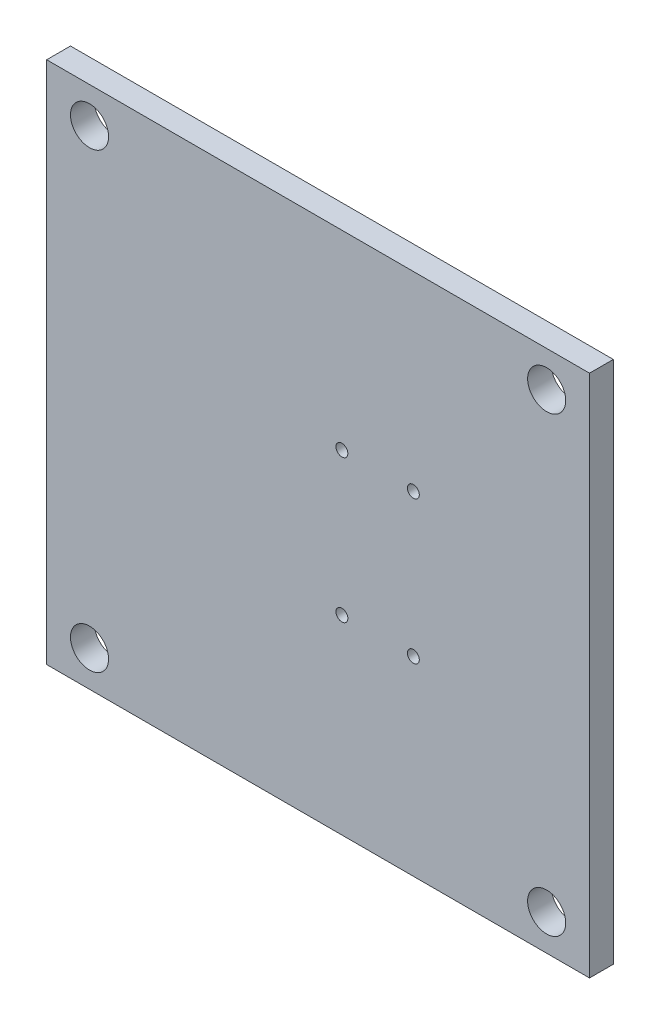
ISO-10303-21;
HEADER;
FILE_DESCRIPTION(('STEP AP214'),'2;1');
FILE_NAME('part.step','',(''),(''),'','','');
FILE_SCHEMA(('AUTOMOTIVE_DESIGN { 1 0 10303 214 1 1 1 1 }'));
ENDSEC;
DATA;
#1=APPLICATION_CONTEXT('core data for automotive mechanical design processes');
#2=APPLICATION_PROTOCOL_DEFINITION('international standard','automotive_design',2000,#1);
#3=PRODUCT_CONTEXT('',#1,'mechanical');
#4=PRODUCT('Part','Part','',(#3));
#5=PRODUCT_RELATED_PRODUCT_CATEGORY('part','',(#4));
#6=PRODUCT_DEFINITION_FORMATION('','',#4);
#7=PRODUCT_DEFINITION_CONTEXT('part definition',#1,'design');
#8=PRODUCT_DEFINITION('design','',#6,#7);
#9=PRODUCT_DEFINITION_SHAPE('','',#8);
#10=(LENGTH_UNIT() NAMED_UNIT(*) SI_UNIT(.MILLI.,.METRE.));
#11=(NAMED_UNIT(*) PLANE_ANGLE_UNIT() SI_UNIT($,.RADIAN.));
#12=(NAMED_UNIT(*) SI_UNIT($,.STERADIAN.) SOLID_ANGLE_UNIT());
#13=UNCERTAINTY_MEASURE_WITH_UNIT(LENGTH_MEASURE(1.E-05),#10,'distance_accuracy_value','');
#14=(GEOMETRIC_REPRESENTATION_CONTEXT(3) GLOBAL_UNCERTAINTY_ASSIGNED_CONTEXT((#13)) GLOBAL_UNIT_ASSIGNED_CONTEXT((#10,
#11,#12)) REPRESENTATION_CONTEXT('',''));
#15=CARTESIAN_POINT('',(0.,0.,0.));
#16=DIRECTION('',(0.,0.,1.));
#17=DIRECTION('',(1.,0.,0.));
#18=AXIS2_PLACEMENT_3D('',#15,#16,#17);
#19=CARTESIAN_POINT('',(0.,0.,2.5));
#20=DIRECTION('',(0.,0.,1.));
#21=DIRECTION('',(1.,0.,0.));
#22=AXIS2_PLACEMENT_3D('',#19,#20,#21);
#23=PLANE('',#22);
#24=CARTESIAN_POINT('',(5.00000000000012,-15.,2.5));
#25=DIRECTION('',(0.,0.,1.));
#26=DIRECTION('',(1.,0.,0.));
#27=AXIS2_PLACEMENT_3D('',#24,#25,#26);
#28=CIRCLE('',#27,1.25);
#29=CARTESIAN_POINT('',(6.25000000000011,-15.,2.5));
#30=VERTEX_POINT('',#29);
#31=EDGE_CURVE('E158',#30,#30,#28,.T.);
#32=ORIENTED_EDGE('',*,*,#31,.F.);
#33=EDGE_LOOP('',(#32));
#34=FACE_BOUND('',#33,.T.);
#35=CARTESIAN_POINT('',(20.0000000000001,-15.,2.5));
#36=DIRECTION('',(0.,0.,1.));
#37=DIRECTION('',(1.,0.,0.));
#38=AXIS2_PLACEMENT_3D('',#35,#36,#37);
#39=CIRCLE('',#38,1.25);
#40=CARTESIAN_POINT('',(21.2500000000001,-15.,2.5));
#41=VERTEX_POINT('',#40);
#42=EDGE_CURVE('E152',#41,#41,#39,.T.);
#43=ORIENTED_EDGE('',*,*,#42,.F.);
#44=EDGE_LOOP('',(#43));
#45=FACE_BOUND('',#44,.T.);
#46=CARTESIAN_POINT('',(5.00000000000012,15.,2.5));
#47=DIRECTION('',(0.,0.,1.));
#48=DIRECTION('',(1.,0.,0.));
#49=AXIS2_PLACEMENT_3D('',#46,#47,#48);
#50=CIRCLE('',#49,1.25);
#51=CARTESIAN_POINT('',(6.25000000000011,15.,2.5));
#52=VERTEX_POINT('',#51);
#53=EDGE_CURVE('E146',#52,#52,#50,.T.);
#54=ORIENTED_EDGE('',*,*,#53,.F.);
#55=EDGE_LOOP('',(#54));
#56=FACE_BOUND('',#55,.T.);
#57=CARTESIAN_POINT('',(20.0000000000001,15.,2.5));
#58=DIRECTION('',(0.,0.,1.));
#59=DIRECTION('',(1.,0.,0.));
#60=AXIS2_PLACEMENT_3D('',#57,#58,#59);
#61=CIRCLE('',#60,1.25);
#62=CARTESIAN_POINT('',(21.2500000000001,15.,2.5));
#63=VERTEX_POINT('',#62);
#64=EDGE_CURVE('E140',#63,#63,#61,.T.);
#65=ORIENTED_EDGE('',*,*,#64,.F.);
#66=EDGE_LOOP('',(#65));
#67=FACE_BOUND('',#66,.T.);
#68=CARTESIAN_POINT('',(-48.,-47.5,2.5));
#69=DIRECTION('',(0.,0.,-1.));
#70=DIRECTION('',(1.,0.,0.));
#71=AXIS2_PLACEMENT_3D('',#68,#69,#70);
#72=CIRCLE('',#71,4.);
#73=CARTESIAN_POINT('',(-44.,-47.5,2.5));
#74=VERTEX_POINT('',#73);
#75=EDGE_CURVE('E120',#74,#74,#72,.T.);
#76=ORIENTED_EDGE('',*,*,#75,.T.);
#77=EDGE_LOOP('',(#76));
#78=FACE_BOUND('',#77,.T.);
#79=CARTESIAN_POINT('',(-48.,47.5,2.5));
#80=DIRECTION('',(0.,0.,1.));
#81=DIRECTION('',(1.,0.,0.));
#82=AXIS2_PLACEMENT_3D('',#79,#80,#81);
#83=CIRCLE('',#82,4.);
#84=CARTESIAN_POINT('',(-44.,47.5,2.5));
#85=VERTEX_POINT('',#84);
#86=EDGE_CURVE('E114',#85,#85,#83,.T.);
#87=ORIENTED_EDGE('',*,*,#86,.F.);
#88=EDGE_LOOP('',(#87));
#89=FACE_BOUND('',#88,.T.);
#90=DIRECTION('',(0.,1.,0.));
#91=VECTOR('',#90,1.);
#92=CARTESIAN_POINT('',(57.,55.,2.5));
#93=LINE('',#92,#91);
#94=CARTESIAN_POINT('',(57.,-55.,2.5));
#95=VERTEX_POINT('',#94);
#96=CARTESIAN_POINT('',(57.,55.,2.5));
#97=VERTEX_POINT('',#96);
#98=EDGE_CURVE('E87',#95,#97,#93,.T.);
#99=ORIENTED_EDGE('',*,*,#98,.T.);
#100=DIRECTION('',(-1.,0.,0.));
#101=VECTOR('',#100,1.);
#102=CARTESIAN_POINT('',(-57.,55.,2.5));
#103=LINE('',#102,#101);
#104=CARTESIAN_POINT('',(-57.,55.,2.5));
#105=VERTEX_POINT('',#104);
#106=EDGE_CURVE('E82',#97,#105,#103,.T.);
#107=ORIENTED_EDGE('',*,*,#106,.T.);
#108=DIRECTION('',(0.,-1.,0.));
#109=VECTOR('',#108,1.);
#110=CARTESIAN_POINT('',(-57.,55.,2.5));
#111=LINE('',#110,#109);
#112=CARTESIAN_POINT('',(-57.,-55.,2.5));
#113=VERTEX_POINT('',#112);
#114=EDGE_CURVE('E85',#105,#113,#111,.T.);
#115=ORIENTED_EDGE('',*,*,#114,.T.);
#116=DIRECTION('',(1.,0.,0.));
#117=VECTOR('',#116,1.);
#118=CARTESIAN_POINT('',(-57.,-55.,2.5));
#119=LINE('',#118,#117);
#120=EDGE_CURVE('E52',#113,#95,#119,.T.);
#121=ORIENTED_EDGE('',*,*,#120,.T.);
#122=EDGE_LOOP('',(#99,#107,#115,#121));
#123=FACE_BOUND('',#122,.T.);
#124=CARTESIAN_POINT('',(48.,-47.5,2.5));
#125=DIRECTION('',(0.,0.,1.));
#126=DIRECTION('',(-1.,0.,0.));
#127=AXIS2_PLACEMENT_3D('',#124,#125,#126);
#128=CIRCLE('',#127,4.);
#129=CARTESIAN_POINT('',(44.,-47.5,2.5));
#130=VERTEX_POINT('',#129);
#131=EDGE_CURVE('E126',#130,#130,#128,.T.);
#132=ORIENTED_EDGE('',*,*,#131,.F.);
#133=EDGE_LOOP('',(#132));
#134=FACE_BOUND('',#133,.T.);
#135=CARTESIAN_POINT('',(48.,47.5,2.5));
#136=DIRECTION('',(0.,0.,-1.));
#137=DIRECTION('',(-1.,0.,0.));
#138=AXIS2_PLACEMENT_3D('',#135,#136,#137);
#139=CIRCLE('',#138,4.);
#140=CARTESIAN_POINT('',(44.,47.5,2.5));
#141=VERTEX_POINT('',#140);
#142=EDGE_CURVE('E132',#141,#141,#139,.T.);
#143=ORIENTED_EDGE('',*,*,#142,.T.);
#144=EDGE_LOOP('',(#143));
#145=FACE_BOUND('',#144,.T.);
#146=ADVANCED_FACE('F35',(#34,#45,#56,#67,#78,#89,#123,#134,#145),#23,.T.);
#147=CARTESIAN_POINT('',(0.,0.,-2.5));
#148=DIRECTION('',(0.,0.,1.));
#149=DIRECTION('',(1.,0.,0.));
#150=AXIS2_PLACEMENT_3D('',#147,#148,#149);
#151=PLANE('',#150);
#152=CARTESIAN_POINT('',(5.00000000000012,-15.,-2.5));
#153=DIRECTION('',(0.,0.,1.));
#154=DIRECTION('',(1.,0.,0.));
#155=AXIS2_PLACEMENT_3D('',#152,#153,#154);
#156=CIRCLE('',#155,1.25);
#157=CARTESIAN_POINT('',(6.25000000000011,-15.,-2.5));
#158=VERTEX_POINT('',#157);
#159=EDGE_CURVE('E155',#158,#158,#156,.T.);
#160=ORIENTED_EDGE('',*,*,#159,.T.);
#161=EDGE_LOOP('',(#160));
#162=FACE_BOUND('',#161,.T.);
#163=CARTESIAN_POINT('',(20.0000000000001,-15.,-2.5));
#164=DIRECTION('',(0.,0.,1.));
#165=DIRECTION('',(1.,0.,0.));
#166=AXIS2_PLACEMENT_3D('',#163,#164,#165);
#167=CIRCLE('',#166,1.25);
#168=CARTESIAN_POINT('',(21.2500000000001,-15.,-2.5));
#169=VERTEX_POINT('',#168);
#170=EDGE_CURVE('E149',#169,#169,#167,.T.);
#171=ORIENTED_EDGE('',*,*,#170,.T.);
#172=EDGE_LOOP('',(#171));
#173=FACE_BOUND('',#172,.T.);
#174=CARTESIAN_POINT('',(5.00000000000012,15.,-2.5));
#175=DIRECTION('',(0.,0.,1.));
#176=DIRECTION('',(1.,0.,0.));
#177=AXIS2_PLACEMENT_3D('',#174,#175,#176);
#178=CIRCLE('',#177,1.25);
#179=CARTESIAN_POINT('',(6.25000000000011,15.,-2.5));
#180=VERTEX_POINT('',#179);
#181=EDGE_CURVE('E143',#180,#180,#178,.T.);
#182=ORIENTED_EDGE('',*,*,#181,.T.);
#183=EDGE_LOOP('',(#182));
#184=FACE_BOUND('',#183,.T.);
#185=CARTESIAN_POINT('',(20.0000000000001,15.,-2.5));
#186=DIRECTION('',(0.,0.,1.));
#187=DIRECTION('',(1.,0.,0.));
#188=AXIS2_PLACEMENT_3D('',#185,#186,#187);
#189=CIRCLE('',#188,1.25);
#190=CARTESIAN_POINT('',(21.2500000000001,15.,-2.5));
#191=VERTEX_POINT('',#190);
#192=EDGE_CURVE('E135',#191,#191,#189,.T.);
#193=ORIENTED_EDGE('',*,*,#192,.T.);
#194=EDGE_LOOP('',(#193));
#195=FACE_BOUND('',#194,.T.);
#196=CARTESIAN_POINT('',(-48.,-47.5,-2.5));
#197=DIRECTION('',(0.,0.,-1.));
#198=DIRECTION('',(1.,0.,0.));
#199=AXIS2_PLACEMENT_3D('',#196,#197,#198);
#200=CIRCLE('',#199,4.);
#201=CARTESIAN_POINT('',(-44.,-47.5,-2.5));
#202=VERTEX_POINT('',#201);
#203=EDGE_CURVE('E117',#202,#202,#200,.T.);
#204=ORIENTED_EDGE('',*,*,#203,.F.);
#205=EDGE_LOOP('',(#204));
#206=FACE_BOUND('',#205,.T.);
#207=CARTESIAN_POINT('',(-48.,47.5,-2.5));
#208=DIRECTION('',(0.,0.,1.));
#209=DIRECTION('',(1.,0.,0.));
#210=AXIS2_PLACEMENT_3D('',#207,#208,#209);
#211=CIRCLE('',#210,4.);
#212=CARTESIAN_POINT('',(-44.,47.5,-2.5));
#213=VERTEX_POINT('',#212);
#214=EDGE_CURVE('E102',#213,#213,#211,.T.);
#215=ORIENTED_EDGE('',*,*,#214,.T.);
#216=EDGE_LOOP('',(#215));
#217=FACE_BOUND('',#216,.T.);
#218=DIRECTION('',(0.,1.,0.));
#219=VECTOR('',#218,1.);
#220=CARTESIAN_POINT('',(57.,55.,-2.5));
#221=LINE('',#220,#219);
#222=CARTESIAN_POINT('',(57.,-55.,-2.5));
#223=VERTEX_POINT('',#222);
#224=CARTESIAN_POINT('',(57.,55.,-2.5));
#225=VERTEX_POINT('',#224);
#226=EDGE_CURVE('E99',#223,#225,#221,.T.);
#227=ORIENTED_EDGE('',*,*,#226,.F.);
#228=DIRECTION('',(1.,0.,0.));
#229=VECTOR('',#228,1.);
#230=CARTESIAN_POINT('',(-57.,-55.,-2.5));
#231=LINE('',#230,#229);
#232=CARTESIAN_POINT('',(-57.,-55.,-2.5));
#233=VERTEX_POINT('',#232);
#234=EDGE_CURVE('E75',#233,#223,#231,.T.);
#235=ORIENTED_EDGE('',*,*,#234,.F.);
#236=DIRECTION('',(0.,-1.,0.));
#237=VECTOR('',#236,1.);
#238=CARTESIAN_POINT('',(-57.,55.,-2.5));
#239=LINE('',#238,#237);
#240=CARTESIAN_POINT('',(-57.,55.,-2.5));
#241=VERTEX_POINT('',#240);
#242=EDGE_CURVE('E69',#241,#233,#239,.T.);
#243=ORIENTED_EDGE('',*,*,#242,.F.);
#244=DIRECTION('',(-1.,0.,0.));
#245=VECTOR('',#244,1.);
#246=CARTESIAN_POINT('',(-57.,55.,-2.5));
#247=LINE('',#246,#245);
#248=EDGE_CURVE('E91',#225,#241,#247,.T.);
#249=ORIENTED_EDGE('',*,*,#248,.F.);
#250=EDGE_LOOP('',(#227,#235,#243,#249));
#251=FACE_BOUND('',#250,.T.);
#252=CARTESIAN_POINT('',(48.,-47.5,-2.5));
#253=DIRECTION('',(0.,0.,1.));
#254=DIRECTION('',(-1.,0.,0.));
#255=AXIS2_PLACEMENT_3D('',#252,#253,#254);
#256=CIRCLE('',#255,4.);
#257=CARTESIAN_POINT('',(44.,-47.5,-2.5));
#258=VERTEX_POINT('',#257);
#259=EDGE_CURVE('E123',#258,#258,#256,.T.);
#260=ORIENTED_EDGE('',*,*,#259,.T.);
#261=EDGE_LOOP('',(#260));
#262=FACE_BOUND('',#261,.T.);
#263=CARTESIAN_POINT('',(48.,47.5,-2.5));
#264=DIRECTION('',(0.,0.,-1.));
#265=DIRECTION('',(-1.,0.,0.));
#266=AXIS2_PLACEMENT_3D('',#263,#264,#265);
#267=CIRCLE('',#266,4.);
#268=CARTESIAN_POINT('',(44.,47.5,-2.5));
#269=VERTEX_POINT('',#268);
#270=EDGE_CURVE('E129',#269,#269,#267,.T.);
#271=ORIENTED_EDGE('',*,*,#270,.F.);
#272=EDGE_LOOP('',(#271));
#273=FACE_BOUND('',#272,.T.);
#274=ADVANCED_FACE('F110',(#162,#173,#184,#195,#206,#217,#251,#262,#273),#151,.F.);
#275=CARTESIAN_POINT('',(57.,55.,2.5));
#276=DIRECTION('',(-1.,0.,0.));
#277=DIRECTION('',(0.,-1.,0.));
#278=AXIS2_PLACEMENT_3D('',#275,#276,#277);
#279=PLANE('',#278);
#280=ORIENTED_EDGE('',*,*,#226,.T.);
#281=DIRECTION('',(0.,0.,-1.));
#282=VECTOR('',#281,1.);
#283=CARTESIAN_POINT('',(57.,55.,2.5));
#284=LINE('',#283,#282);
#285=EDGE_CURVE('E11',#97,#225,#284,.T.);
#286=ORIENTED_EDGE('',*,*,#285,.F.);
#287=ORIENTED_EDGE('',*,*,#98,.F.);
#288=DIRECTION('',(0.,0.,-1.));
#289=VECTOR('',#288,1.);
#290=CARTESIAN_POINT('',(57.,-55.,2.5));
#291=LINE('',#290,#289);
#292=EDGE_CURVE('E95',#95,#223,#291,.T.);
#293=ORIENTED_EDGE('',*,*,#292,.T.);
#294=EDGE_LOOP('',(#280,#286,#287,#293));
#295=FACE_BOUND('',#294,.T.);
#296=ADVANCED_FACE('F37',(#295),#279,.F.);
#297=CARTESIAN_POINT('',(-57.,55.,2.5));
#298=DIRECTION('',(0.,-1.,0.));
#299=DIRECTION('',(0.,0.,-1.));
#300=AXIS2_PLACEMENT_3D('',#297,#298,#299);
#301=PLANE('',#300);
#302=ORIENTED_EDGE('',*,*,#248,.T.);
#303=DIRECTION('',(0.,0.,-1.));
#304=VECTOR('',#303,1.);
#305=CARTESIAN_POINT('',(-57.,55.,2.5));
#306=LINE('',#305,#304);
#307=EDGE_CURVE('E44',#105,#241,#306,.T.);
#308=ORIENTED_EDGE('',*,*,#307,.F.);
#309=ORIENTED_EDGE('',*,*,#106,.F.);
#310=ORIENTED_EDGE('',*,*,#285,.T.);
#311=EDGE_LOOP('',(#302,#308,#309,#310));
#312=FACE_BOUND('',#311,.T.);
#313=ADVANCED_FACE('F90',(#312),#301,.F.);
#314=CARTESIAN_POINT('',(-57.,55.,2.5));
#315=DIRECTION('',(1.,0.,0.));
#316=DIRECTION('',(0.,0.,-1.));
#317=AXIS2_PLACEMENT_3D('',#314,#315,#316);
#318=PLANE('',#317);
#319=ORIENTED_EDGE('',*,*,#242,.T.);
#320=DIRECTION('',(0.,0.,-1.));
#321=VECTOR('',#320,1.);
#322=CARTESIAN_POINT('',(-57.,-55.,2.5));
#323=LINE('',#322,#321);
#324=EDGE_CURVE('E92',#113,#233,#323,.T.);
#325=ORIENTED_EDGE('',*,*,#324,.F.);
#326=ORIENTED_EDGE('',*,*,#114,.F.);
#327=ORIENTED_EDGE('',*,*,#307,.T.);
#328=EDGE_LOOP('',(#319,#325,#326,#327));
#329=FACE_BOUND('',#328,.T.);
#330=ADVANCED_FACE('F93',(#329),#318,.F.);
#331=CARTESIAN_POINT('',(-57.,-55.,2.5));
#332=DIRECTION('',(0.,1.,0.));
#333=DIRECTION('',(0.,0.,1.));
#334=AXIS2_PLACEMENT_3D('',#331,#332,#333);
#335=PLANE('',#334);
#336=ORIENTED_EDGE('',*,*,#234,.T.);
#337=ORIENTED_EDGE('',*,*,#292,.F.);
#338=ORIENTED_EDGE('',*,*,#120,.F.);
#339=ORIENTED_EDGE('',*,*,#324,.T.);
#340=EDGE_LOOP('',(#336,#337,#338,#339));
#341=FACE_BOUND('',#340,.T.);
#342=ADVANCED_FACE('F107',(#341),#335,.F.);
#343=CARTESIAN_POINT('',(-48.,47.5,-2.5));
#344=DIRECTION('',(0.,0.,1.));
#345=DIRECTION('',(1.,0.,0.));
#346=AXIS2_PLACEMENT_3D('',#343,#344,#345);
#347=CYLINDRICAL_SURFACE('',#346,4.);
#348=ORIENTED_EDGE('',*,*,#214,.F.);
#349=EDGE_LOOP('',(#348));
#350=FACE_BOUND('',#349,.T.);
#351=ORIENTED_EDGE('',*,*,#86,.T.);
#352=EDGE_LOOP('',(#351));
#353=FACE_BOUND('',#352,.T.);
#354=ADVANCED_FACE('F177',(#350,#353),#347,.F.);
#355=CARTESIAN_POINT('',(-48.,-47.5,-2.5));
#356=DIRECTION('',(0.,0.,1.));
#357=DIRECTION('',(1.,0.,0.));
#358=AXIS2_PLACEMENT_3D('',#355,#356,#357);
#359=CYLINDRICAL_SURFACE('',#358,4.);
#360=ORIENTED_EDGE('',*,*,#203,.T.);
#361=EDGE_LOOP('',(#360));
#362=FACE_BOUND('',#361,.T.);
#363=ORIENTED_EDGE('',*,*,#75,.F.);
#364=EDGE_LOOP('',(#363));
#365=FACE_BOUND('',#364,.T.);
#366=ADVANCED_FACE('F179',(#362,#365),#359,.F.);
#367=CARTESIAN_POINT('',(48.,-47.5,-2.5));
#368=DIRECTION('',(0.,0.,1.));
#369=DIRECTION('',(1.,0.,0.));
#370=AXIS2_PLACEMENT_3D('',#367,#368,#369);
#371=CYLINDRICAL_SURFACE('',#370,4.);
#372=ORIENTED_EDGE('',*,*,#259,.F.);
#373=EDGE_LOOP('',(#372));
#374=FACE_BOUND('',#373,.T.);
#375=ORIENTED_EDGE('',*,*,#131,.T.);
#376=EDGE_LOOP('',(#375));
#377=FACE_BOUND('',#376,.T.);
#378=ADVANCED_FACE('F186',(#374,#377),#371,.F.);
#379=CARTESIAN_POINT('',(48.,47.5,-2.5));
#380=DIRECTION('',(0.,0.,1.));
#381=DIRECTION('',(1.,0.,0.));
#382=AXIS2_PLACEMENT_3D('',#379,#380,#381);
#383=CYLINDRICAL_SURFACE('',#382,4.);
#384=ORIENTED_EDGE('',*,*,#270,.T.);
#385=EDGE_LOOP('',(#384));
#386=FACE_BOUND('',#385,.T.);
#387=ORIENTED_EDGE('',*,*,#142,.F.);
#388=EDGE_LOOP('',(#387));
#389=FACE_BOUND('',#388,.T.);
#390=ADVANCED_FACE('F236',(#386,#389),#383,.F.);
#391=CARTESIAN_POINT('',(20.0000000000001,15.,2.5));
#392=DIRECTION('',(0.,0.,1.));
#393=DIRECTION('',(1.,0.,0.));
#394=AXIS2_PLACEMENT_3D('',#391,#392,#393);
#395=CYLINDRICAL_SURFACE('',#394,1.25);
#396=ORIENTED_EDGE('',*,*,#192,.F.);
#397=EDGE_LOOP('',(#396));
#398=FACE_BOUND('',#397,.T.);
#399=ORIENTED_EDGE('',*,*,#64,.T.);
#400=EDGE_LOOP('',(#399));
#401=FACE_BOUND('',#400,.T.);
#402=ADVANCED_FACE('F224',(#398,#401),#395,.F.);
#403=CARTESIAN_POINT('',(5.00000000000012,15.,2.5));
#404=DIRECTION('',(0.,0.,1.));
#405=DIRECTION('',(1.,0.,0.));
#406=AXIS2_PLACEMENT_3D('',#403,#404,#405);
#407=CYLINDRICAL_SURFACE('',#406,1.25);
#408=ORIENTED_EDGE('',*,*,#181,.F.);
#409=EDGE_LOOP('',(#408));
#410=FACE_BOUND('',#409,.T.);
#411=ORIENTED_EDGE('',*,*,#53,.T.);
#412=EDGE_LOOP('',(#411));
#413=FACE_BOUND('',#412,.T.);
#414=ADVANCED_FACE('F218',(#410,#413),#407,.F.);
#415=CARTESIAN_POINT('',(20.0000000000001,-15.,2.5));
#416=DIRECTION('',(0.,0.,1.));
#417=DIRECTION('',(1.,0.,0.));
#418=AXIS2_PLACEMENT_3D('',#415,#416,#417);
#419=CYLINDRICAL_SURFACE('',#418,1.25);
#420=ORIENTED_EDGE('',*,*,#170,.F.);
#421=EDGE_LOOP('',(#420));
#422=FACE_BOUND('',#421,.T.);
#423=ORIENTED_EDGE('',*,*,#42,.T.);
#424=EDGE_LOOP('',(#423));
#425=FACE_BOUND('',#424,.T.);
#426=ADVANCED_FACE('F223',(#422,#425),#419,.F.);
#427=CARTESIAN_POINT('',(5.00000000000012,-15.,2.5));
#428=DIRECTION('',(0.,0.,1.));
#429=DIRECTION('',(1.,0.,0.));
#430=AXIS2_PLACEMENT_3D('',#427,#428,#429);
#431=CYLINDRICAL_SURFACE('',#430,1.25);
#432=ORIENTED_EDGE('',*,*,#159,.F.);
#433=EDGE_LOOP('',(#432));
#434=FACE_BOUND('',#433,.T.);
#435=ORIENTED_EDGE('',*,*,#31,.T.);
#436=EDGE_LOOP('',(#435));
#437=FACE_BOUND('',#436,.T.);
#438=ADVANCED_FACE('F162',(#434,#437),#431,.F.);
#439=CLOSED_SHELL('',(#146,#274,#296,#313,#330,#342,#354,#366,#378,#390,#402,#414,#426,#438));
#440=MANIFOLD_SOLID_BREP('B2',#439);
#441=ADVANCED_BREP_SHAPE_REPRESENTATION('',(#18,#440),#14);
#442=SHAPE_DEFINITION_REPRESENTATION(#9,#441);
ENDSEC;
END-ISO-10303-21;
